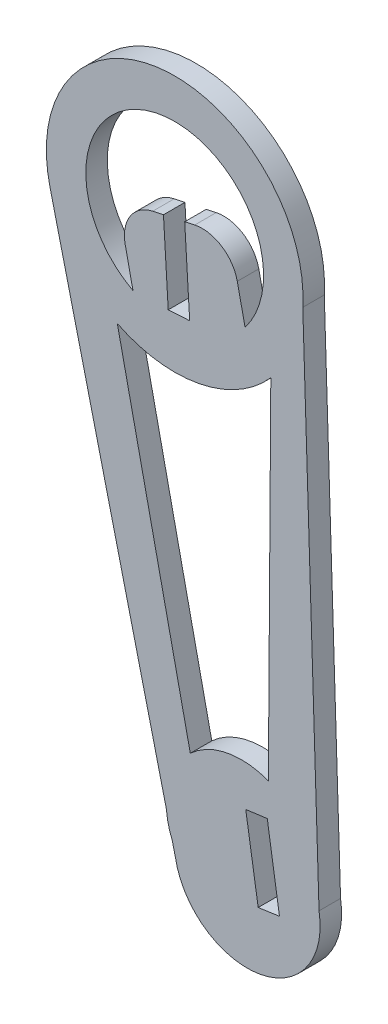
ISO-10303-21;
HEADER;
FILE_DESCRIPTION(('STEP AP214'),'2;1');
FILE_NAME('part.step','',(''),(''),'','','');
FILE_SCHEMA(('AUTOMOTIVE_DESIGN { 1 0 10303 214 1 1 1 1 }'));
ENDSEC;
DATA;
#1=APPLICATION_CONTEXT('core data for automotive mechanical design processes');
#2=APPLICATION_PROTOCOL_DEFINITION('international standard','automotive_design',2000,#1);
#3=PRODUCT_CONTEXT('',#1,'mechanical');
#4=PRODUCT('Part','Part','',(#3));
#5=PRODUCT_RELATED_PRODUCT_CATEGORY('part','',(#4));
#6=PRODUCT_DEFINITION_FORMATION('','',#4);
#7=PRODUCT_DEFINITION_CONTEXT('part definition',#1,'design');
#8=PRODUCT_DEFINITION('design','',#6,#7);
#9=PRODUCT_DEFINITION_SHAPE('','',#8);
#10=(LENGTH_UNIT() NAMED_UNIT(*) SI_UNIT(.MILLI.,.METRE.));
#11=(NAMED_UNIT(*) PLANE_ANGLE_UNIT() SI_UNIT($,.RADIAN.));
#12=(NAMED_UNIT(*) SI_UNIT($,.STERADIAN.) SOLID_ANGLE_UNIT());
#13=UNCERTAINTY_MEASURE_WITH_UNIT(LENGTH_MEASURE(1.E-05),#10,'distance_accuracy_value','');
#14=(GEOMETRIC_REPRESENTATION_CONTEXT(3) GLOBAL_UNCERTAINTY_ASSIGNED_CONTEXT((#13)) GLOBAL_UNIT_ASSIGNED_CONTEXT((#10,
#11,#12)) REPRESENTATION_CONTEXT('',''));
#15=CARTESIAN_POINT('',(0.,0.,0.));
#16=DIRECTION('',(0.,0.,1.));
#17=DIRECTION('',(1.,0.,0.));
#18=AXIS2_PLACEMENT_3D('',#15,#16,#17);
#19=CARTESIAN_POINT('',(-1719.58246588491,33.9776276731795,3.));
#20=DIRECTION('',(-0.211077873619773,0.977469248246795,0.));
#21=DIRECTION('',(-0.977469248246795,-0.211077873619773,0.));
#22=AXIS2_PLACEMENT_3D('',#19,#20,#21);
#23=PLANE('',#22);
#24=DIRECTION('',(0.,0.,-1.));
#25=VECTOR('',#24,1.);
#26=CARTESIAN_POINT('',(-1715.11169617099,34.943060157475,3.));
#27=LINE('',#26,#25);
#28=CARTESIAN_POINT('',(-1715.11169617099,34.943060157475,3.));
#29=VERTEX_POINT('',#28);
#30=CARTESIAN_POINT('',(-1715.11169617099,34.943060157475,0.));
#31=VERTEX_POINT('',#30);
#32=EDGE_CURVE('E42',#29,#31,#27,.T.);
#33=ORIENTED_EDGE('',*,*,#32,.F.);
#34=DIRECTION('',(0.977469248246795,0.211077873619773,0.));
#35=VECTOR('',#34,1.);
#36=CARTESIAN_POINT('',(-1719.58246588491,33.9776276731795,3.));
#37=LINE('',#36,#35);
#38=CARTESIAN_POINT('',(-1713.71765039543,35.2440949148982,3.));
#39=VERTEX_POINT('',#38);
#40=EDGE_CURVE('E287',#29,#39,#37,.T.);
#41=ORIENTED_EDGE('',*,*,#40,.T.);
#42=DIRECTION('',(0.,0.,-1.));
#43=VECTOR('',#42,1.);
#44=CARTESIAN_POINT('',(-1713.71765039543,35.2440949148982,3.));
#45=LINE('',#44,#43);
#46=CARTESIAN_POINT('',(-1713.71765039543,35.2440949148982,0.));
#47=VERTEX_POINT('',#46);
#48=EDGE_CURVE('E318',#39,#47,#45,.T.);
#49=ORIENTED_EDGE('',*,*,#48,.T.);
#50=DIRECTION('',(0.977469248246795,0.211077873619773,0.));
#51=VECTOR('',#50,1.);
#52=CARTESIAN_POINT('',(-1719.58246588491,33.9776276731795,0.));
#53=LINE('',#52,#51);
#54=EDGE_CURVE('E305',#31,#47,#53,.T.);
#55=ORIENTED_EDGE('',*,*,#54,.F.);
#56=EDGE_LOOP('',(#33,#41,#49,#55));
#57=FACE_BOUND('',#56,.T.);
#58=ADVANCED_FACE('F34',(#57),#23,.T.);
#59=CARTESIAN_POINT('',(-1716.5106018206,33.9650604741354,3.));
#60=DIRECTION('',(0.,0.,1.));
#61=DIRECTION('',(1.,0.,0.));
#62=AXIS2_PLACEMENT_3D('',#59,#60,#61);
#63=PLANE('',#62);
#64=DIRECTION('',(0.989743613392245,0.142855100536391,0.));
#65=VECTOR('',#64,1.);
#66=CARTESIAN_POINT('',(-1705.41786240118,-42.888814215497,3.));
#67=LINE('',#66,#65);
#68=CARTESIAN_POINT('',(-1704.85848427635,-42.8080761160747,3.));
#69=VERTEX_POINT('',#68);
#70=CARTESIAN_POINT('',(-1701.88925343617,-42.3795108144655,3.));
#71=VERTEX_POINT('',#70);
#72=EDGE_CURVE('E228',#69,#71,#67,.T.);
#73=ORIENTED_EDGE('',*,*,#72,.F.);
#74=DIRECTION('',(0.156085903120736,-0.987743484335374,0.));
#75=VECTOR('',#74,1.);
#76=CARTESIAN_POINT('',(-1716.97869462045,33.891091180926,3.));
#77=LINE('',#76,#75);
#78=CARTESIAN_POINT('',(-1706.59468100713,-31.8210684871815,3.));
#79=VERTEX_POINT('',#78);
#80=EDGE_CURVE('E221',#79,#69,#77,.T.);
#81=ORIENTED_EDGE('',*,*,#80,.F.);
#82=DIRECTION('',(-0.991414191872544,-0.130758939096759,0.));
#83=VECTOR('',#82,1.);
#84=CARTESIAN_POINT('',(-1707.81279215618,-31.9817267900972,3.));
#85=LINE('',#84,#83);
#86=CARTESIAN_POINT('',(-1703.58791548837,-31.4245021755748,3.));
#87=VERTEX_POINT('',#86);
#88=EDGE_CURVE('E201',#87,#79,#85,.T.);
#89=ORIENTED_EDGE('',*,*,#88,.F.);
#90=DIRECTION('',(-0.15322695298129,0.988191024488722,0.));
#91=VECTOR('',#90,1.);
#92=CARTESIAN_POINT('',(-1713.7924448474,34.3865325381462,3.));
#93=LINE('',#92,#91);
#94=EDGE_CURVE('E226',#71,#87,#93,.T.);
#95=ORIENTED_EDGE('',*,*,#94,.F.);
#96=EDGE_LOOP('',(#73,#81,#89,#95));
#97=FACE_BOUND('',#96,.T.);
#98=DIRECTION('',(-0.0595160949501729,0.998227346069963,0.));
#99=VECTOR('',#98,1.);
#100=CARTESIAN_POINT('',(-1715.45074014612,40.6296390194517,3.));
#101=LINE('',#100,#99);
#102=CARTESIAN_POINT('',(-1714.41901314898,23.3251081513247,3.));
#103=VERTEX_POINT('',#102);
#104=EDGE_CURVE('E236',#103,#29,#101,.T.);
#105=ORIENTED_EDGE('',*,*,#104,.F.);
#106=DIRECTION('',(0.998227346069963,0.0595160949501783,0.));
#107=VECTOR('',#106,1.);
#108=CARTESIAN_POINT('',(-1714.41901314898,23.3251081513247,3.));
#109=LINE('',#108,#107);
#110=CARTESIAN_POINT('',(-1717.41369518719,23.1465598664742,3.));
#111=VERTEX_POINT('',#110);
#112=EDGE_CURVE('E233',#111,#103,#109,.T.);
#113=ORIENTED_EDGE('',*,*,#112,.F.);
#114=DIRECTION('',(0.0595160949501849,-0.998227346069962,0.));
#115=VECTOR('',#114,1.);
#116=CARTESIAN_POINT('',(-1717.41369518719,23.1465598664742,3.));
#117=LINE('',#116,#115);
#118=CARTESIAN_POINT('',(-1718.078822065,34.302329387077,3.));
#119=VERTEX_POINT('',#118);
#120=EDGE_CURVE('E230',#119,#111,#117,.T.);
#121=ORIENTED_EDGE('',*,*,#120,.F.);
#122=CARTESIAN_POINT('',(-1719.58246588491,33.9776276731795,3.));
#123=VERTEX_POINT('',#122);
#124=EDGE_CURVE('E288',#123,#119,#37,.T.);
#125=ORIENTED_EDGE('',*,*,#124,.F.);
#126=CARTESIAN_POINT('',(-1718.52707651681,29.0902814319454,3.));
#127=DIRECTION('',(0.,0.,-1.));
#128=DIRECTION('',(1.,0.,0.));
#129=AXIS2_PLACEMENT_3D('',#126,#127,#128);
#130=CIRCLE('',#129,4.9999999999999);
#131=CARTESIAN_POINT('',(-1723.41442275804,28.0348920638467,3.));
#132=VERTEX_POINT('',#131);
#133=EDGE_CURVE('E285',#132,#123,#130,.T.);
#134=ORIENTED_EDGE('',*,*,#133,.F.);
#135=DIRECTION('',(-0.211077873619766,0.977469248246797,0.));
#136=VECTOR('',#135,1.);
#137=CARTESIAN_POINT('',(-1723.41442275804,28.0348920638467,3.));
#138=LINE('',#137,#136);
#139=CARTESIAN_POINT('',(-1722.32908992804,23.0088822445995,3.));
#140=VERTEX_POINT('',#139);
#141=EDGE_CURVE('E282',#140,#132,#138,.T.);
#142=ORIENTED_EDGE('',*,*,#141,.F.);
#143=CARTESIAN_POINT('',(-1716.5106018206,33.9650604741355,3.));
#144=DIRECTION('',(0.,0.,1.));
#145=DIRECTION('',(1.,0.,0.));
#146=AXIS2_PLACEMENT_3D('',#143,#144,#145);
#147=CIRCLE('',#146,12.4053474459106);
#148=CARTESIAN_POINT('',(-1706.68958195609,26.3861282225158,3.));
#149=VERTEX_POINT('',#148);
#150=EDGE_CURVE('E280',#149,#140,#147,.T.);
#151=ORIENTED_EDGE('',*,*,#150,.F.);
#152=DIRECTION('',(0.21107787361981,-0.977469248246787,0.));
#153=VECTOR('',#152,1.);
#154=CARTESIAN_POINT('',(-1707.77491478609,31.412138041763,3.));
#155=LINE('',#154,#153);
#156=CARTESIAN_POINT('',(-1707.77491478609,31.412138041763,3.));
#157=VERTEX_POINT('',#156);
#158=EDGE_CURVE('E294',#157,#149,#155,.T.);
#159=ORIENTED_EDGE('',*,*,#158,.F.);
#160=CARTESIAN_POINT('',(-1712.66226102733,30.3567486736641,3.));
#161=DIRECTION('',(0.,0.,-1.));
#162=DIRECTION('',(1.,0.,0.));
#163=AXIS2_PLACEMENT_3D('',#160,#161,#162);
#164=CIRCLE('',#163,5.00000000000015);
#165=EDGE_CURVE('E291',#39,#157,#164,.T.);
#166=ORIENTED_EDGE('',*,*,#165,.F.);
#167=ORIENTED_EDGE('',*,*,#40,.F.);
#168=EDGE_LOOP('',(#105,#113,#121,#125,#134,#142,#151,#159,#166,#167));
#169=FACE_BOUND('',#168,.T.);
#170=CARTESIAN_POINT('',(-1716.5106018206,33.9650604741354,3.));
#171=DIRECTION('',(0.,0.,1.));
#172=DIRECTION('',(1.,0.,0.));
#173=AXIS2_PLACEMENT_3D('',#170,#171,#172);
#174=CIRCLE('',#173,17.9111808315285);
#175=CARTESIAN_POINT('',(-1698.63505557387,32.8357929413751,3.));
#176=VERTEX_POINT('',#175);
#177=CARTESIAN_POINT('',(-1733.90600437721,29.6976996183658,3.));
#178=VERTEX_POINT('',#177);
#179=EDGE_CURVE('E329',#176,#178,#174,.T.);
#180=ORIENTED_EDGE('',*,*,#179,.T.);
#181=DIRECTION('',(0.235469604622765,-0.971881713635357,0.));
#182=VECTOR('',#181,1.);
#183=CARTESIAN_POINT('',(-1733.90600437721,29.6976996183658,3.));
#184=LINE('',#183,#182);
#185=CARTESIAN_POINT('',(-1717.66005438348,-37.3561426167344,3.));
#186=VERTEX_POINT('',#185);
#187=EDGE_CURVE('E332',#178,#186,#184,.T.);
#188=ORIENTED_EDGE('',*,*,#187,.T.);
#189=CARTESIAN_POINT('',(-1707.19420804248,-36.5970647843689,3.));
#190=DIRECTION('',(0.,0.,1.));
#191=DIRECTION('',(1.,0.,0.));
#192=AXIS2_PLACEMENT_3D('',#189,#190,#191);
#193=CIRCLE('',#192,10.4933378287889);
#194=CARTESIAN_POINT('',(-1716.84690492063,-40.7123511374156,3.));
#195=VERTEX_POINT('',#194);
#196=EDGE_CURVE('E335',#186,#195,#193,.T.);
#197=ORIENTED_EDGE('',*,*,#196,.T.);
#198=DIRECTION('',(0.235469604622766,-0.971881713635357,0.));
#199=VECTOR('',#198,1.);
#200=CARTESIAN_POINT('',(-1716.84690492063,-40.7123511374156,3.));
#201=LINE('',#200,#199);
#202=CARTESIAN_POINT('',(-1716.41715679337,-42.4861017114057,3.));
#203=VERTEX_POINT('',#202);
#204=EDGE_CURVE('E337',#195,#203,#201,.T.);
#205=ORIENTED_EDGE('',*,*,#204,.T.);
#206=CARTESIAN_POINT('',(-1706.39152252489,-40.7250657336656,3.));
#207=DIRECTION('',(0.,0.,1.));
#208=DIRECTION('',(1.,0.,0.));
#209=AXIS2_PLACEMENT_3D('',#206,#207,#208);
#210=CIRCLE('',#209,10.1791252178296);
#211=CARTESIAN_POINT('',(-1696.36588825641,-38.9640297559255,3.));
#212=VERTEX_POINT('',#211);
#213=EDGE_CURVE('E339',#203,#212,#210,.T.);
#214=ORIENTED_EDGE('',*,*,#213,.T.);
#215=DIRECTION('',(-0.0315883081331849,0.999500964876614,0.));
#216=VECTOR('',#215,1.);
#217=CARTESIAN_POINT('',(-1698.63505557387,32.8357929413751,3.));
#218=LINE('',#217,#216);
#219=EDGE_CURVE('E341',#212,#176,#218,.T.);
#220=ORIENTED_EDGE('',*,*,#219,.T.);
#221=EDGE_LOOP('',(#180,#188,#197,#205,#214,#220));
#222=FACE_BOUND('',#221,.T.);
#223=DIRECTION('',(0.00699320731993253,0.999975547226721,0.));
#224=VECTOR('',#223,1.);
#225=CARTESIAN_POINT('',(-1703.09668855954,22.0958848580948,3.));
#226=LINE('',#225,#224);
#227=CARTESIAN_POINT('',(-1703.43862767385,-26.7988121399489,3.));
#228=VERTEX_POINT('',#227);
#229=CARTESIAN_POINT('',(-1703.09668855954,22.0958848580949,3.));
#230=VERTEX_POINT('',#229);
#231=EDGE_CURVE('E251',#228,#230,#226,.T.);
#232=ORIENTED_EDGE('',*,*,#231,.F.);
#233=CARTESIAN_POINT('',(-1707.19420804248,-36.5970647843689,3.));
#234=DIRECTION('',(0.,0.,-1.));
#235=DIRECTION('',(1.,0.,0.));
#236=AXIS2_PLACEMENT_3D('',#233,#234,#235);
#237=CIRCLE('',#236,10.4933378287891);
#238=CARTESIAN_POINT('',(-1714.33272975361,-28.9060540205757,3.));
#239=VERTEX_POINT('',#238);
#240=EDGE_CURVE('E249',#239,#228,#237,.T.);
#241=ORIENTED_EDGE('',*,*,#240,.F.);
#242=DIRECTION('',(0.212428974645688,-0.977176509506333,0.));
#243=VECTOR('',#242,1.);
#244=CARTESIAN_POINT('',(-1724.51729446098,17.9430983052172,3.));
#245=LINE('',#244,#243);
#246=CARTESIAN_POINT('',(-1724.51729446098,17.9430983052172,3.));
#247=VERTEX_POINT('',#246);
#248=EDGE_CURVE('E257',#247,#239,#245,.T.);
#249=ORIENTED_EDGE('',*,*,#248,.F.);
#250=CARTESIAN_POINT('',(-1716.5106018206,33.9650604741354,3.));
#251=DIRECTION('',(0.,0.,-1.));
#252=DIRECTION('',(1.,0.,0.));
#253=AXIS2_PLACEMENT_3D('',#250,#251,#252);
#254=CIRCLE('',#253,17.9111808315287);
#255=EDGE_CURVE('E254',#230,#247,#254,.T.);
#256=ORIENTED_EDGE('',*,*,#255,.F.);
#257=EDGE_LOOP('',(#232,#241,#249,#256));
#258=FACE_BOUND('',#257,.T.);
#259=ADVANCED_FACE('F398',(#97,#169,#222,#258),#63,.T.);
#260=CARTESIAN_POINT('',(-1716.5106018206,33.9650604741354,0.));
#261=DIRECTION('',(0.,0.,1.));
#262=DIRECTION('',(1.,0.,0.));
#263=AXIS2_PLACEMENT_3D('',#260,#261,#262);
#264=PLANE('',#263);
#265=DIRECTION('',(-0.156085903120735,0.987743484335373,0.));
#266=VECTOR('',#265,1.);
#267=CARTESIAN_POINT('',(-1704.85848427635,-42.8080761160747,0.));
#268=LINE('',#267,#266);
#269=CARTESIAN_POINT('',(-1704.85848427635,-42.8080761160747,0.));
#270=VERTEX_POINT('',#269);
#271=CARTESIAN_POINT('',(-1706.59468100713,-31.8210684871815,0.));
#272=VERTEX_POINT('',#271);
#273=EDGE_CURVE('E207',#270,#272,#268,.T.);
#274=ORIENTED_EDGE('',*,*,#273,.F.);
#275=DIRECTION('',(-0.989743613392245,-0.142855100536391,0.));
#276=VECTOR('',#275,1.);
#277=CARTESIAN_POINT('',(-1704.85848427635,-42.8080761160747,0.));
#278=LINE('',#277,#276);
#279=CARTESIAN_POINT('',(-1701.88925343617,-42.3795108144655,0.));
#280=VERTEX_POINT('',#279);
#281=EDGE_CURVE('E57',#280,#270,#278,.T.);
#282=ORIENTED_EDGE('',*,*,#281,.F.);
#283=DIRECTION('',(0.15322695298129,-0.988191024488722,0.));
#284=VECTOR('',#283,1.);
#285=CARTESIAN_POINT('',(-1701.88925343617,-42.3795108144655,0.));
#286=LINE('',#285,#284);
#287=CARTESIAN_POINT('',(-1703.58791548837,-31.4245021755748,0.));
#288=VERTEX_POINT('',#287);
#289=EDGE_CURVE('E214',#288,#280,#286,.T.);
#290=ORIENTED_EDGE('',*,*,#289,.F.);
#291=DIRECTION('',(0.991414191872544,0.130758939096759,0.));
#292=VECTOR('',#291,1.);
#293=CARTESIAN_POINT('',(-1703.58791548837,-31.4245021755748,0.));
#294=LINE('',#293,#292);
#295=EDGE_CURVE('E198',#272,#288,#294,.T.);
#296=ORIENTED_EDGE('',*,*,#295,.F.);
#297=EDGE_LOOP('',(#274,#282,#290,#296));
#298=FACE_BOUND('',#297,.T.);
#299=DIRECTION('',(0.998227346069963,0.0595160949501783,0.));
#300=VECTOR('',#299,1.);
#301=CARTESIAN_POINT('',(-1715.87106718483,23.2385340996217,0.));
#302=LINE('',#301,#300);
#303=CARTESIAN_POINT('',(-1717.41369518719,23.1465598664742,0.));
#304=VERTEX_POINT('',#303);
#305=CARTESIAN_POINT('',(-1714.41901314898,23.3251081513247,0.));
#306=VERTEX_POINT('',#305);
#307=EDGE_CURVE('E11',#304,#306,#302,.T.);
#308=ORIENTED_EDGE('',*,*,#307,.T.);
#309=DIRECTION('',(-0.0595160949501729,0.998227346069963,0.));
#310=VECTOR('',#309,1.);
#311=CARTESIAN_POINT('',(-1715.05854778476,34.0516345258384,0.));
#312=LINE('',#311,#310);
#313=EDGE_CURVE('E245',#306,#31,#312,.T.);
#314=ORIENTED_EDGE('',*,*,#313,.T.);
#315=ORIENTED_EDGE('',*,*,#54,.T.);
#316=CARTESIAN_POINT('',(-1712.66226102733,30.3567486736641,0.));
#317=DIRECTION('',(0.,0.,-1.));
#318=DIRECTION('',(1.,0.,0.));
#319=AXIS2_PLACEMENT_3D('',#316,#317,#318);
#320=CIRCLE('',#319,5.00000000000015);
#321=CARTESIAN_POINT('',(-1707.77491478609,31.412138041763,0.));
#322=VERTEX_POINT('',#321);
#323=EDGE_CURVE('E309',#47,#322,#320,.T.);
#324=ORIENTED_EDGE('',*,*,#323,.T.);
#325=DIRECTION('',(0.21107787361981,-0.977469248246787,0.));
#326=VECTOR('',#325,1.);
#327=CARTESIAN_POINT('',(-1707.77491478609,31.412138041763,0.));
#328=LINE('',#327,#326);
#329=CARTESIAN_POINT('',(-1706.68958195609,26.3861282225158,0.));
#330=VERTEX_POINT('',#329);
#331=EDGE_CURVE('E283',#322,#330,#328,.T.);
#332=ORIENTED_EDGE('',*,*,#331,.T.);
#333=CARTESIAN_POINT('',(-1716.5106018206,33.9650604741355,0.));
#334=DIRECTION('',(0.,0.,1.));
#335=DIRECTION('',(1.,0.,0.));
#336=AXIS2_PLACEMENT_3D('',#333,#334,#335);
#337=CIRCLE('',#336,12.4053474459106);
#338=CARTESIAN_POINT('',(-1722.32908992804,23.0088822445995,0.));
#339=VERTEX_POINT('',#338);
#340=EDGE_CURVE('E279',#330,#339,#337,.T.);
#341=ORIENTED_EDGE('',*,*,#340,.T.);
#342=DIRECTION('',(-0.211077873619766,0.977469248246797,0.));
#343=VECTOR('',#342,1.);
#344=CARTESIAN_POINT('',(-1723.41442275804,28.0348920638467,0.));
#345=LINE('',#344,#343);
#346=CARTESIAN_POINT('',(-1723.41442275804,28.0348920638467,0.));
#347=VERTEX_POINT('',#346);
#348=EDGE_CURVE('E299',#339,#347,#345,.T.);
#349=ORIENTED_EDGE('',*,*,#348,.T.);
#350=CARTESIAN_POINT('',(-1718.52707651681,29.0902814319454,0.));
#351=DIRECTION('',(0.,0.,-1.));
#352=DIRECTION('',(1.,0.,0.));
#353=AXIS2_PLACEMENT_3D('',#350,#351,#352);
#354=CIRCLE('',#353,4.9999999999999);
#355=CARTESIAN_POINT('',(-1719.58246588491,33.9776276731795,0.));
#356=VERTEX_POINT('',#355);
#357=EDGE_CURVE('E302',#347,#356,#354,.T.);
#358=ORIENTED_EDGE('',*,*,#357,.T.);
#359=CARTESIAN_POINT('',(-1718.078822065,34.3023293870771,0.));
#360=VERTEX_POINT('',#359);
#361=EDGE_CURVE('E306',#356,#360,#53,.T.);
#362=ORIENTED_EDGE('',*,*,#361,.T.);
#363=DIRECTION('',(0.0595160949501849,-0.998227346069963,0.));
#364=VECTOR('',#363,1.);
#365=CARTESIAN_POINT('',(-1718.05322982297,33.8730862409879,0.));
#366=LINE('',#365,#364);
#367=EDGE_CURVE('E241',#360,#304,#366,.T.);
#368=ORIENTED_EDGE('',*,*,#367,.T.);
#369=EDGE_LOOP('',(#308,#314,#315,#324,#332,#341,#349,#358,#362,#368));
#370=FACE_BOUND('',#369,.T.);
#371=CARTESIAN_POINT('',(-1716.5106018206,33.9650604741354,0.));
#372=DIRECTION('',(0.,0.,1.));
#373=DIRECTION('',(1.,0.,0.));
#374=AXIS2_PLACEMENT_3D('',#371,#372,#373);
#375=CIRCLE('',#374,17.9111808315285);
#376=CARTESIAN_POINT('',(-1698.63505557387,32.8357929413751,0.));
#377=VERTEX_POINT('',#376);
#378=CARTESIAN_POINT('',(-1733.90600437721,29.6976996183658,0.));
#379=VERTEX_POINT('',#378);
#380=EDGE_CURVE('E328',#377,#379,#375,.T.);
#381=ORIENTED_EDGE('',*,*,#380,.F.);
#382=DIRECTION('',(-0.0315883081331849,0.999500964876614,0.));
#383=VECTOR('',#382,1.);
#384=CARTESIAN_POINT('',(-1698.63505557387,32.8357929413751,0.));
#385=LINE('',#384,#383);
#386=CARTESIAN_POINT('',(-1696.36588825641,-38.9640297559255,0.));
#387=VERTEX_POINT('',#386);
#388=EDGE_CURVE('E333',#387,#377,#385,.T.);
#389=ORIENTED_EDGE('',*,*,#388,.F.);
#390=CARTESIAN_POINT('',(-1706.39152252489,-40.7250657336656,0.));
#391=DIRECTION('',(0.,0.,1.));
#392=DIRECTION('',(1.,0.,0.));
#393=AXIS2_PLACEMENT_3D('',#390,#391,#392);
#394=CIRCLE('',#393,10.1791252178296);
#395=CARTESIAN_POINT('',(-1716.41715679337,-42.4861017114057,0.));
#396=VERTEX_POINT('',#395);
#397=EDGE_CURVE('E352',#396,#387,#394,.T.);
#398=ORIENTED_EDGE('',*,*,#397,.F.);
#399=DIRECTION('',(0.235469604622766,-0.971881713635357,0.));
#400=VECTOR('',#399,1.);
#401=CARTESIAN_POINT('',(-1716.84690492063,-40.7123511374156,0.));
#402=LINE('',#401,#400);
#403=CARTESIAN_POINT('',(-1716.84690492063,-40.7123511374156,0.));
#404=VERTEX_POINT('',#403);
#405=EDGE_CURVE('E350',#404,#396,#402,.T.);
#406=ORIENTED_EDGE('',*,*,#405,.F.);
#407=CARTESIAN_POINT('',(-1707.19420804248,-36.5970647843689,0.));
#408=DIRECTION('',(0.,0.,1.));
#409=DIRECTION('',(1.,0.,0.));
#410=AXIS2_PLACEMENT_3D('',#407,#408,#409);
#411=CIRCLE('',#410,10.4933378287889);
#412=CARTESIAN_POINT('',(-1717.66005438348,-37.3561426167344,0.));
#413=VERTEX_POINT('',#412);
#414=EDGE_CURVE('E348',#413,#404,#411,.T.);
#415=ORIENTED_EDGE('',*,*,#414,.F.);
#416=DIRECTION('',(0.235469604622765,-0.971881713635357,0.));
#417=VECTOR('',#416,1.);
#418=CARTESIAN_POINT('',(-1733.90600437721,29.6976996183658,0.));
#419=LINE('',#418,#417);
#420=EDGE_CURVE('E346',#379,#413,#419,.T.);
#421=ORIENTED_EDGE('',*,*,#420,.F.);
#422=EDGE_LOOP('',(#381,#389,#398,#406,#415,#421));
#423=FACE_BOUND('',#422,.T.);
#424=CARTESIAN_POINT('',(-1707.19420804248,-36.5970647843689,0.));
#425=DIRECTION('',(0.,0.,-1.));
#426=DIRECTION('',(1.,0.,0.));
#427=AXIS2_PLACEMENT_3D('',#424,#425,#426);
#428=CIRCLE('',#427,10.4933378287891);
#429=CARTESIAN_POINT('',(-1714.33272975361,-28.9060540205757,0.));
#430=VERTEX_POINT('',#429);
#431=CARTESIAN_POINT('',(-1703.43862767385,-26.7988121399489,0.));
#432=VERTEX_POINT('',#431);
#433=EDGE_CURVE('E248',#430,#432,#428,.T.);
#434=ORIENTED_EDGE('',*,*,#433,.T.);
#435=DIRECTION('',(0.00699320731993253,0.999975547226721,0.));
#436=VECTOR('',#435,1.);
#437=CARTESIAN_POINT('',(-1703.09668855954,22.0958848580948,0.));
#438=LINE('',#437,#436);
#439=CARTESIAN_POINT('',(-1703.09668855954,22.0958848580949,0.));
#440=VERTEX_POINT('',#439);
#441=EDGE_CURVE('E262',#432,#440,#438,.T.);
#442=ORIENTED_EDGE('',*,*,#441,.T.);
#443=CARTESIAN_POINT('',(-1716.5106018206,33.9650604741354,0.));
#444=DIRECTION('',(0.,0.,-1.));
#445=DIRECTION('',(1.,0.,0.));
#446=AXIS2_PLACEMENT_3D('',#443,#444,#445);
#447=CIRCLE('',#446,17.9111808315287);
#448=CARTESIAN_POINT('',(-1724.51729446098,17.9430983052172,0.));
#449=VERTEX_POINT('',#448);
#450=EDGE_CURVE('E265',#440,#449,#447,.T.);
#451=ORIENTED_EDGE('',*,*,#450,.T.);
#452=DIRECTION('',(0.212428974645688,-0.977176509506333,0.));
#453=VECTOR('',#452,1.);
#454=CARTESIAN_POINT('',(-1724.51729446098,17.9430983052172,0.));
#455=LINE('',#454,#453);
#456=EDGE_CURVE('E252',#449,#430,#455,.T.);
#457=ORIENTED_EDGE('',*,*,#456,.T.);
#458=EDGE_LOOP('',(#434,#442,#451,#457));
#459=FACE_BOUND('',#458,.T.);
#460=ADVANCED_FACE('F211',(#298,#370,#423,#459),#264,.F.);
#461=CARTESIAN_POINT('',(-1716.5106018206,33.9650604741354,3.));
#462=DIRECTION('',(0.,0.,-1.));
#463=DIRECTION('',(-1.,0.,0.));
#464=AXIS2_PLACEMENT_3D('',#461,#462,#463);
#465=CYLINDRICAL_SURFACE('',#464,17.9111808315285);
#466=ORIENTED_EDGE('',*,*,#380,.T.);
#467=DIRECTION('',(0.,0.,-1.));
#468=VECTOR('',#467,1.);
#469=CARTESIAN_POINT('',(-1733.90600437721,29.6976996183658,3.));
#470=LINE('',#469,#468);
#471=EDGE_CURVE('E369',#178,#379,#470,.T.);
#472=ORIENTED_EDGE('',*,*,#471,.F.);
#473=ORIENTED_EDGE('',*,*,#179,.F.);
#474=DIRECTION('',(0.,0.,-1.));
#475=VECTOR('',#474,1.);
#476=CARTESIAN_POINT('',(-1698.63505557387,32.8357929413751,3.));
#477=LINE('',#476,#475);
#478=EDGE_CURVE('E343',#176,#377,#477,.T.);
#479=ORIENTED_EDGE('',*,*,#478,.T.);
#480=EDGE_LOOP('',(#466,#472,#473,#479));
#481=FACE_BOUND('',#480,.T.);
#482=ADVANCED_FACE('F36',(#481),#465,.T.);
#483=CARTESIAN_POINT('',(-1733.90600437721,29.6976996183658,3.));
#484=DIRECTION('',(0.971881713635357,0.235469604622765,0.));
#485=DIRECTION('',(-0.235469604622765,0.971881713635357,0.));
#486=AXIS2_PLACEMENT_3D('',#483,#484,#485);
#487=PLANE('',#486);
#488=ORIENTED_EDGE('',*,*,#420,.T.);
#489=DIRECTION('',(0.,0.,-1.));
#490=VECTOR('',#489,1.);
#491=CARTESIAN_POINT('',(-1717.66005438348,-37.3561426167344,3.));
#492=LINE('',#491,#490);
#493=EDGE_CURVE('E366',#186,#413,#492,.T.);
#494=ORIENTED_EDGE('',*,*,#493,.F.);
#495=ORIENTED_EDGE('',*,*,#187,.F.);
#496=ORIENTED_EDGE('',*,*,#471,.T.);
#497=EDGE_LOOP('',(#488,#494,#495,#496));
#498=FACE_BOUND('',#497,.T.);
#499=ADVANCED_FACE('F469',(#498),#487,.F.);
#500=CARTESIAN_POINT('',(-1707.19420804248,-36.5970647843689,3.));
#501=DIRECTION('',(0.,0.,-1.));
#502=DIRECTION('',(-1.,0.,0.));
#503=AXIS2_PLACEMENT_3D('',#500,#501,#502);
#504=CYLINDRICAL_SURFACE('',#503,10.4933378287889);
#505=ORIENTED_EDGE('',*,*,#414,.T.);
#506=DIRECTION('',(0.,0.,-1.));
#507=VECTOR('',#506,1.);
#508=CARTESIAN_POINT('',(-1716.84690492063,-40.7123511374156,3.));
#509=LINE('',#508,#507);
#510=EDGE_CURVE('E363',#195,#404,#509,.T.);
#511=ORIENTED_EDGE('',*,*,#510,.F.);
#512=ORIENTED_EDGE('',*,*,#196,.F.);
#513=ORIENTED_EDGE('',*,*,#493,.T.);
#514=EDGE_LOOP('',(#505,#511,#512,#513));
#515=FACE_BOUND('',#514,.T.);
#516=ADVANCED_FACE('F466',(#515),#504,.T.);
#517=CARTESIAN_POINT('',(-1716.84690492063,-40.7123511374156,3.));
#518=DIRECTION('',(0.971881713635357,0.235469604622766,0.));
#519=DIRECTION('',(-0.235469604622766,0.971881713635357,0.));
#520=AXIS2_PLACEMENT_3D('',#517,#518,#519);
#521=PLANE('',#520);
#522=ORIENTED_EDGE('',*,*,#405,.T.);
#523=DIRECTION('',(0.,0.,-1.));
#524=VECTOR('',#523,1.);
#525=CARTESIAN_POINT('',(-1716.41715679337,-42.4861017114057,3.));
#526=LINE('',#525,#524);
#527=EDGE_CURVE('E360',#203,#396,#526,.T.);
#528=ORIENTED_EDGE('',*,*,#527,.F.);
#529=ORIENTED_EDGE('',*,*,#204,.F.);
#530=ORIENTED_EDGE('',*,*,#510,.T.);
#531=EDGE_LOOP('',(#522,#528,#529,#530));
#532=FACE_BOUND('',#531,.T.);
#533=ADVANCED_FACE('F462',(#532),#521,.F.);
#534=CARTESIAN_POINT('',(-1706.39152252489,-40.7250657336656,3.));
#535=DIRECTION('',(0.,0.,-1.));
#536=DIRECTION('',(-1.,0.,0.));
#537=AXIS2_PLACEMENT_3D('',#534,#535,#536);
#538=CYLINDRICAL_SURFACE('',#537,10.1791252178296);
#539=ORIENTED_EDGE('',*,*,#397,.T.);
#540=DIRECTION('',(0.,0.,-1.));
#541=VECTOR('',#540,1.);
#542=CARTESIAN_POINT('',(-1696.36588825641,-38.9640297559255,3.));
#543=LINE('',#542,#541);
#544=EDGE_CURVE('E357',#212,#387,#543,.T.);
#545=ORIENTED_EDGE('',*,*,#544,.F.);
#546=ORIENTED_EDGE('',*,*,#213,.F.);
#547=ORIENTED_EDGE('',*,*,#527,.T.);
#548=EDGE_LOOP('',(#539,#545,#546,#547));
#549=FACE_BOUND('',#548,.T.);
#550=ADVANCED_FACE('F458',(#549),#538,.T.);
#551=CARTESIAN_POINT('',(-1698.63505557387,32.8357929413751,3.));
#552=DIRECTION('',(-0.999500964876614,-0.0315883081331849,0.));
#553=DIRECTION('',(0.0315883081331849,-0.999500964876614,0.));
#554=AXIS2_PLACEMENT_3D('',#551,#552,#553);
#555=PLANE('',#554);
#556=ORIENTED_EDGE('',*,*,#388,.T.);
#557=ORIENTED_EDGE('',*,*,#478,.F.);
#558=ORIENTED_EDGE('',*,*,#219,.F.);
#559=ORIENTED_EDGE('',*,*,#544,.T.);
#560=EDGE_LOOP('',(#556,#557,#558,#559));
#561=FACE_BOUND('',#560,.T.);
#562=ADVANCED_FACE('F452',(#561),#555,.F.);
#563=CARTESIAN_POINT('',(-1716.5106018206,33.9650604741355,3.));
#564=DIRECTION('',(0.,0.,-1.));
#565=DIRECTION('',(-1.,0.,0.));
#566=AXIS2_PLACEMENT_3D('',#563,#564,#565);
#567=CYLINDRICAL_SURFACE('',#566,12.4053474459106);
#568=ORIENTED_EDGE('',*,*,#340,.F.);
#569=DIRECTION('',(0.,0.,-1.));
#570=VECTOR('',#569,1.);
#571=CARTESIAN_POINT('',(-1706.68958195609,26.3861282225158,3.));
#572=LINE('',#571,#570);
#573=EDGE_CURVE('E296',#149,#330,#572,.T.);
#574=ORIENTED_EDGE('',*,*,#573,.F.);
#575=ORIENTED_EDGE('',*,*,#150,.T.);
#576=DIRECTION('',(0.,0.,-1.));
#577=VECTOR('',#576,1.);
#578=CARTESIAN_POINT('',(-1722.32908992804,23.0088822445995,3.));
#579=LINE('',#578,#577);
#580=EDGE_CURVE('E325',#140,#339,#579,.T.);
#581=ORIENTED_EDGE('',*,*,#580,.T.);
#582=EDGE_LOOP('',(#568,#574,#575,#581));
#583=FACE_BOUND('',#582,.T.);
#584=ADVANCED_FACE('F394',(#583),#567,.F.);
#585=CARTESIAN_POINT('',(-1723.41442275804,28.0348920638467,3.));
#586=DIRECTION('',(-0.977469248246797,-0.211077873619766,0.));
#587=DIRECTION('',(0.211077873619766,-0.977469248246797,0.));
#588=AXIS2_PLACEMENT_3D('',#585,#586,#587);
#589=PLANE('',#588);
#590=ORIENTED_EDGE('',*,*,#348,.F.);
#591=ORIENTED_EDGE('',*,*,#580,.F.);
#592=ORIENTED_EDGE('',*,*,#141,.T.);
#593=DIRECTION('',(0.,0.,-1.));
#594=VECTOR('',#593,1.);
#595=CARTESIAN_POINT('',(-1723.41442275804,28.0348920638467,3.));
#596=LINE('',#595,#594);
#597=EDGE_CURVE('E323',#132,#347,#596,.T.);
#598=ORIENTED_EDGE('',*,*,#597,.T.);
#599=EDGE_LOOP('',(#590,#591,#592,#598));
#600=FACE_BOUND('',#599,.T.);
#601=ADVANCED_FACE('F404',(#600),#589,.T.);
#602=CARTESIAN_POINT('',(-1718.52707651681,29.0902814319454,3.));
#603=DIRECTION('',(0.,0.,-1.));
#604=DIRECTION('',(-1.,0.,0.));
#605=AXIS2_PLACEMENT_3D('',#602,#603,#604);
#606=CYLINDRICAL_SURFACE('',#605,4.9999999999999);
#607=ORIENTED_EDGE('',*,*,#357,.F.);
#608=ORIENTED_EDGE('',*,*,#597,.F.);
#609=ORIENTED_EDGE('',*,*,#133,.T.);
#610=DIRECTION('',(0.,0.,-1.));
#611=VECTOR('',#610,1.);
#612=CARTESIAN_POINT('',(-1719.58246588491,33.9776276731795,3.));
#613=LINE('',#612,#611);
#614=EDGE_CURVE('E321',#123,#356,#613,.T.);
#615=ORIENTED_EDGE('',*,*,#614,.T.);
#616=EDGE_LOOP('',(#607,#608,#609,#615));
#617=FACE_BOUND('',#616,.T.);
#618=ADVANCED_FACE('F407',(#617),#606,.T.);
#619=DIRECTION('',(0.,0.,1.));
#620=VECTOR('',#619,1.);
#621=CARTESIAN_POINT('',(-1718.078822065,34.302329387077,3.));
#622=LINE('',#621,#620);
#623=EDGE_CURVE('E372',#360,#119,#622,.T.);
#624=ORIENTED_EDGE('',*,*,#623,.F.);
#625=ORIENTED_EDGE('',*,*,#361,.F.);
#626=ORIENTED_EDGE('',*,*,#614,.F.);
#627=ORIENTED_EDGE('',*,*,#124,.T.);
#628=EDGE_LOOP('',(#624,#625,#626,#627));
#629=FACE_BOUND('',#628,.T.);
#630=ADVANCED_FACE('F412',(#629),#23,.T.);
#631=CARTESIAN_POINT('',(-1712.66226102733,30.3567486736641,3.));
#632=DIRECTION('',(0.,0.,-1.));
#633=DIRECTION('',(-1.,0.,0.));
#634=AXIS2_PLACEMENT_3D('',#631,#632,#633);
#635=CYLINDRICAL_SURFACE('',#634,5.00000000000015);
#636=ORIENTED_EDGE('',*,*,#323,.F.);
#637=ORIENTED_EDGE('',*,*,#48,.F.);
#638=ORIENTED_EDGE('',*,*,#165,.T.);
#639=DIRECTION('',(0.,0.,-1.));
#640=VECTOR('',#639,1.);
#641=CARTESIAN_POINT('',(-1707.77491478609,31.412138041763,3.));
#642=LINE('',#641,#640);
#643=EDGE_CURVE('E316',#157,#322,#642,.T.);
#644=ORIENTED_EDGE('',*,*,#643,.T.);
#645=EDGE_LOOP('',(#636,#637,#638,#644));
#646=FACE_BOUND('',#645,.T.);
#647=ADVANCED_FACE('F386',(#646),#635,.T.);
#648=CARTESIAN_POINT('',(-1707.77491478609,31.412138041763,3.));
#649=DIRECTION('',(0.977469248246787,0.21107787361981,0.));
#650=DIRECTION('',(-0.21107787361981,0.977469248246787,0.));
#651=AXIS2_PLACEMENT_3D('',#648,#649,#650);
#652=PLANE('',#651);
#653=ORIENTED_EDGE('',*,*,#331,.F.);
#654=ORIENTED_EDGE('',*,*,#643,.F.);
#655=ORIENTED_EDGE('',*,*,#158,.T.);
#656=ORIENTED_EDGE('',*,*,#573,.T.);
#657=EDGE_LOOP('',(#653,#654,#655,#656));
#658=FACE_BOUND('',#657,.T.);
#659=ADVANCED_FACE('F389',(#658),#652,.T.);
#660=CARTESIAN_POINT('',(-1707.19420804248,-36.5970647843689,3.));
#661=DIRECTION('',(0.,0.,-1.));
#662=DIRECTION('',(-1.,0.,0.));
#663=AXIS2_PLACEMENT_3D('',#660,#661,#662);
#664=CYLINDRICAL_SURFACE('',#663,10.4933378287891);
#665=ORIENTED_EDGE('',*,*,#433,.F.);
#666=DIRECTION('',(0.,0.,-1.));
#667=VECTOR('',#666,1.);
#668=CARTESIAN_POINT('',(-1714.33272975361,-28.9060540205757,3.));
#669=LINE('',#668,#667);
#670=EDGE_CURVE('E259',#239,#430,#669,.T.);
#671=ORIENTED_EDGE('',*,*,#670,.F.);
#672=ORIENTED_EDGE('',*,*,#240,.T.);
#673=DIRECTION('',(0.,0.,-1.));
#674=VECTOR('',#673,1.);
#675=CARTESIAN_POINT('',(-1703.43862767385,-26.7988121399489,3.));
#676=LINE('',#675,#674);
#677=EDGE_CURVE('E276',#228,#432,#676,.T.);
#678=ORIENTED_EDGE('',*,*,#677,.T.);
#679=EDGE_LOOP('',(#665,#671,#672,#678));
#680=FACE_BOUND('',#679,.T.);
#681=ADVANCED_FACE('F507',(#680),#664,.T.);
#682=CARTESIAN_POINT('',(-1703.09668855954,22.0958848580948,3.));
#683=DIRECTION('',(-0.999975547226721,0.00699320731993253,0.));
#684=DIRECTION('',(-0.00699320731993253,-0.999975547226721,0.));
#685=AXIS2_PLACEMENT_3D('',#682,#683,#684);
#686=PLANE('',#685);
#687=ORIENTED_EDGE('',*,*,#441,.F.);
#688=ORIENTED_EDGE('',*,*,#677,.F.);
#689=ORIENTED_EDGE('',*,*,#231,.T.);
#690=DIRECTION('',(0.,0.,-1.));
#691=VECTOR('',#690,1.);
#692=CARTESIAN_POINT('',(-1703.09668855954,22.0958848580949,3.));
#693=LINE('',#692,#691);
#694=EDGE_CURVE('E274',#230,#440,#693,.T.);
#695=ORIENTED_EDGE('',*,*,#694,.T.);
#696=EDGE_LOOP('',(#687,#688,#689,#695));
#697=FACE_BOUND('',#696,.T.);
#698=ADVANCED_FACE('F502',(#697),#686,.T.);
#699=CARTESIAN_POINT('',(-1716.5106018206,33.9650604741354,3.));
#700=DIRECTION('',(0.,0.,-1.));
#701=DIRECTION('',(-1.,0.,0.));
#702=AXIS2_PLACEMENT_3D('',#699,#700,#701);
#703=CYLINDRICAL_SURFACE('',#702,17.9111808315287);
#704=ORIENTED_EDGE('',*,*,#450,.F.);
#705=ORIENTED_EDGE('',*,*,#694,.F.);
#706=ORIENTED_EDGE('',*,*,#255,.T.);
#707=DIRECTION('',(0.,0.,-1.));
#708=VECTOR('',#707,1.);
#709=CARTESIAN_POINT('',(-1724.51729446098,17.9430983052172,3.));
#710=LINE('',#709,#708);
#711=EDGE_CURVE('E272',#247,#449,#710,.T.);
#712=ORIENTED_EDGE('',*,*,#711,.T.);
#713=EDGE_LOOP('',(#704,#705,#706,#712));
#714=FACE_BOUND('',#713,.T.);
#715=ADVANCED_FACE('F428',(#714),#703,.T.);
#716=CARTESIAN_POINT('',(-1724.51729446098,17.9430983052172,3.));
#717=DIRECTION('',(0.977176509506333,0.212428974645688,0.));
#718=DIRECTION('',(-0.212428974645689,0.977176509506334,0.));
#719=AXIS2_PLACEMENT_3D('',#716,#717,#718);
#720=PLANE('',#719);
#721=ORIENTED_EDGE('',*,*,#456,.F.);
#722=ORIENTED_EDGE('',*,*,#711,.F.);
#723=ORIENTED_EDGE('',*,*,#248,.T.);
#724=ORIENTED_EDGE('',*,*,#670,.T.);
#725=EDGE_LOOP('',(#721,#722,#723,#724));
#726=FACE_BOUND('',#725,.T.);
#727=ADVANCED_FACE('F421',(#726),#720,.T.);
#728=CARTESIAN_POINT('',(-1714.41901314898,23.3251081513247,-95.));
#729=DIRECTION('',(0.0595160949501783,-0.998227346069963,0.));
#730=DIRECTION('',(0.998227346069963,0.0595160949501783,0.));
#731=AXIS2_PLACEMENT_3D('',#728,#729,#730);
#732=PLANE('',#731);
#733=DIRECTION('',(0.,0.,1.));
#734=VECTOR('',#733,1.);
#735=CARTESIAN_POINT('',(-1717.41369518719,23.1465598664742,-95.));
#736=LINE('',#735,#734);
#737=EDGE_CURVE('E238',#304,#111,#736,.T.);
#738=ORIENTED_EDGE('',*,*,#737,.T.);
#739=ORIENTED_EDGE('',*,*,#112,.T.);
#740=DIRECTION('',(0.,0.,1.));
#741=VECTOR('',#740,1.);
#742=CARTESIAN_POINT('',(-1714.41901314898,23.3251081513247,-95.));
#743=LINE('',#742,#741);
#744=EDGE_CURVE('E239',#306,#103,#743,.T.);
#745=ORIENTED_EDGE('',*,*,#744,.F.);
#746=ORIENTED_EDGE('',*,*,#307,.F.);
#747=EDGE_LOOP('',(#738,#739,#745,#746));
#748=FACE_BOUND('',#747,.T.);
#749=ADVANCED_FACE('F419',(#748),#732,.F.);
#750=CARTESIAN_POINT('',(-1715.45074014612,40.6296390194517,-95.));
#751=DIRECTION('',(0.998227346069963,0.0595160949501729,0.));
#752=DIRECTION('',(-0.0595160949501729,0.998227346069963,0.));
#753=AXIS2_PLACEMENT_3D('',#750,#751,#752);
#754=PLANE('',#753);
#755=ORIENTED_EDGE('',*,*,#744,.T.);
#756=ORIENTED_EDGE('',*,*,#104,.T.);
#757=ORIENTED_EDGE('',*,*,#32,.T.);
#758=ORIENTED_EDGE('',*,*,#313,.F.);
#759=EDGE_LOOP('',(#755,#756,#757,#758));
#760=FACE_BOUND('',#759,.T.);
#761=ADVANCED_FACE('F375',(#760),#754,.F.);
#762=CARTESIAN_POINT('',(-1717.41369518719,23.1465598664742,-95.));
#763=DIRECTION('',(-0.998227346069962,-0.0595160949501849,0.));
#764=DIRECTION('',(0.0595160949501849,-0.998227346069963,0.));
#765=AXIS2_PLACEMENT_3D('',#762,#763,#764);
#766=PLANE('',#765);
#767=ORIENTED_EDGE('',*,*,#623,.T.);
#768=ORIENTED_EDGE('',*,*,#120,.T.);
#769=ORIENTED_EDGE('',*,*,#737,.F.);
#770=ORIENTED_EDGE('',*,*,#367,.F.);
#771=EDGE_LOOP('',(#767,#768,#769,#770));
#772=FACE_BOUND('',#771,.T.);
#773=ADVANCED_FACE('F415',(#772),#766,.F.);
#774=CARTESIAN_POINT('',(-1704.85848427635,-42.8080761160747,32.));
#775=DIRECTION('',(0.142855100536391,-0.989743613392245,0.));
#776=DIRECTION('',(0.989743613392245,0.142855100536391,0.));
#777=AXIS2_PLACEMENT_3D('',#774,#775,#776);
#778=PLANE('',#777);
#779=ORIENTED_EDGE('',*,*,#72,.T.);
#780=DIRECTION('',(0.,0.,-1.));
#781=VECTOR('',#780,1.);
#782=CARTESIAN_POINT('',(-1701.88925343617,-42.3795108144655,32.));
#783=LINE('',#782,#781);
#784=EDGE_CURVE('E219',#71,#280,#783,.T.);
#785=ORIENTED_EDGE('',*,*,#784,.T.);
#786=ORIENTED_EDGE('',*,*,#281,.T.);
#787=DIRECTION('',(0.,0.,-1.));
#788=VECTOR('',#787,1.);
#789=CARTESIAN_POINT('',(-1704.85848427635,-42.8080761160747,32.));
#790=LINE('',#789,#788);
#791=EDGE_CURVE('E204',#69,#270,#790,.T.);
#792=ORIENTED_EDGE('',*,*,#791,.F.);
#793=EDGE_LOOP('',(#779,#785,#786,#792));
#794=FACE_BOUND('',#793,.T.);
#795=ADVANCED_FACE('F520',(#794),#778,.F.);
#796=CARTESIAN_POINT('',(-1701.88925343617,-42.3795108144655,32.));
#797=DIRECTION('',(0.988191024488722,0.15322695298129,0.));
#798=DIRECTION('',(-0.15322695298129,0.988191024488722,0.));
#799=AXIS2_PLACEMENT_3D('',#796,#797,#798);
#800=PLANE('',#799);
#801=ORIENTED_EDGE('',*,*,#94,.T.);
#802=DIRECTION('',(0.,0.,-1.));
#803=VECTOR('',#802,1.);
#804=CARTESIAN_POINT('',(-1703.58791548837,-31.4245021755748,32.));
#805=LINE('',#804,#803);
#806=EDGE_CURVE('E203',#87,#288,#805,.T.);
#807=ORIENTED_EDGE('',*,*,#806,.T.);
#808=ORIENTED_EDGE('',*,*,#289,.T.);
#809=ORIENTED_EDGE('',*,*,#784,.F.);
#810=EDGE_LOOP('',(#801,#807,#808,#809));
#811=FACE_BOUND('',#810,.T.);
#812=ADVANCED_FACE('F524',(#811),#800,.F.);
#813=CARTESIAN_POINT('',(-1703.58791548837,-31.4245021755748,32.));
#814=DIRECTION('',(-0.130758939096759,0.991414191872544,0.));
#815=DIRECTION('',(-0.991414191872544,-0.130758939096759,0.));
#816=AXIS2_PLACEMENT_3D('',#813,#814,#815);
#817=PLANE('',#816);
#818=ORIENTED_EDGE('',*,*,#88,.T.);
#819=DIRECTION('',(0.,0.,-1.));
#820=VECTOR('',#819,1.);
#821=CARTESIAN_POINT('',(-1706.59468100713,-31.8210684871815,32.));
#822=LINE('',#821,#820);
#823=EDGE_CURVE('E49',#79,#272,#822,.T.);
#824=ORIENTED_EDGE('',*,*,#823,.T.);
#825=ORIENTED_EDGE('',*,*,#295,.T.);
#826=ORIENTED_EDGE('',*,*,#806,.F.);
#827=EDGE_LOOP('',(#818,#824,#825,#826));
#828=FACE_BOUND('',#827,.T.);
#829=ADVANCED_FACE('F195',(#828),#817,.F.);
#830=CARTESIAN_POINT('',(-1704.85848427635,-42.8080761160747,32.));
#831=DIRECTION('',(-0.987743484335374,-0.156085903120736,0.));
#832=DIRECTION('',(0.156085903120736,-0.987743484335374,0.));
#833=AXIS2_PLACEMENT_3D('',#830,#831,#832);
#834=PLANE('',#833);
#835=ORIENTED_EDGE('',*,*,#80,.T.);
#836=ORIENTED_EDGE('',*,*,#791,.T.);
#837=ORIENTED_EDGE('',*,*,#273,.T.);
#838=ORIENTED_EDGE('',*,*,#823,.F.);
#839=EDGE_LOOP('',(#835,#836,#837,#838));
#840=FACE_BOUND('',#839,.T.);
#841=ADVANCED_FACE('F208',(#840),#834,.F.);
#842=CLOSED_SHELL('',(#58,#259,#460,#482,#499,#516,#533,#550,#562,#584,#601,#618,#630,#647,#659,
#681,#698,#715,#727,#749,#761,#773,#795,#812,#829,#841));
#843=MANIFOLD_SOLID_BREP('B2',#842);
#844=ADVANCED_BREP_SHAPE_REPRESENTATION('',(#18,#843),#14);
#845=SHAPE_DEFINITION_REPRESENTATION(#9,#844);
ENDSEC;
END-ISO-10303-21;
